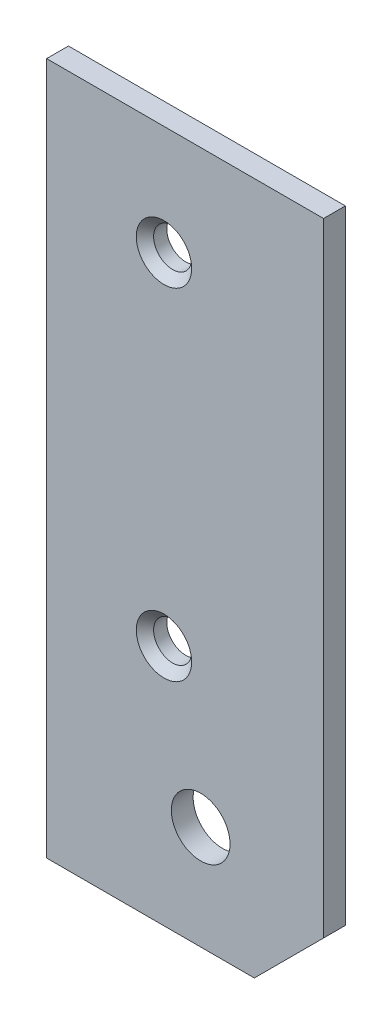
ISO-10303-21;
HEADER;
FILE_DESCRIPTION(('STEP AP214'),'2;1');
FILE_NAME('part.step','',(''),(''),'','','');
FILE_SCHEMA(('AUTOMOTIVE_DESIGN { 1 0 10303 214 1 1 1 1 }'));
ENDSEC;
DATA;
#1=APPLICATION_CONTEXT('core data for automotive mechanical design processes');
#2=APPLICATION_PROTOCOL_DEFINITION('international standard','automotive_design',2000,#1);
#3=PRODUCT_CONTEXT('',#1,'mechanical');
#4=PRODUCT('Part','Part','',(#3));
#5=PRODUCT_RELATED_PRODUCT_CATEGORY('part','',(#4));
#6=PRODUCT_DEFINITION_FORMATION('','',#4);
#7=PRODUCT_DEFINITION_CONTEXT('part definition',#1,'design');
#8=PRODUCT_DEFINITION('design','',#6,#7);
#9=PRODUCT_DEFINITION_SHAPE('','',#8);
#10=(LENGTH_UNIT() NAMED_UNIT(*) SI_UNIT(.MILLI.,.METRE.));
#11=(NAMED_UNIT(*) PLANE_ANGLE_UNIT() SI_UNIT($,.RADIAN.));
#12=(NAMED_UNIT(*) SI_UNIT($,.STERADIAN.) SOLID_ANGLE_UNIT());
#13=UNCERTAINTY_MEASURE_WITH_UNIT(LENGTH_MEASURE(1.E-05),#10,'distance_accuracy_value','');
#14=(GEOMETRIC_REPRESENTATION_CONTEXT(3) GLOBAL_UNCERTAINTY_ASSIGNED_CONTEXT((#13)) GLOBAL_UNIT_ASSIGNED_CONTEXT((#10,
#11,#12)) REPRESENTATION_CONTEXT('',''));
#15=CARTESIAN_POINT('',(0.,0.,0.));
#16=DIRECTION('',(0.,0.,1.));
#17=DIRECTION('',(1.,0.,0.));
#18=AXIS2_PLACEMENT_3D('',#15,#16,#17);
#19=CARTESIAN_POINT('',(10.16,-25.4,1.6002));
#20=DIRECTION('',(-1.,0.,0.));
#21=DIRECTION('',(0.,0.,1.));
#22=AXIS2_PLACEMENT_3D('',#19,#20,#21);
#23=PLANE('',#22);
#24=DIRECTION('',(0.,1.,0.));
#25=VECTOR('',#24,1.);
#26=CARTESIAN_POINT('',(10.16,-25.4,1.6002));
#27=LINE('',#26,#25);
#28=CARTESIAN_POINT('',(10.16,-20.32,1.6002));
#29=VERTEX_POINT('',#28);
#30=CARTESIAN_POINT('',(10.16,25.4,1.6002));
#31=VERTEX_POINT('',#30);
#32=EDGE_CURVE('E81',#29,#31,#27,.T.);
#33=ORIENTED_EDGE('',*,*,#32,.F.);
#34=DIRECTION('',(0.,0.,-1.));
#35=VECTOR('',#34,1.);
#36=CARTESIAN_POINT('',(10.16,-20.32,1.6002));
#37=LINE('',#36,#35);
#38=CARTESIAN_POINT('',(10.16,-20.32,0.));
#39=VERTEX_POINT('',#38);
#40=EDGE_CURVE('E104',#29,#39,#37,.T.);
#41=ORIENTED_EDGE('',*,*,#40,.T.);
#42=DIRECTION('',(0.,1.,0.));
#43=VECTOR('',#42,1.);
#44=CARTESIAN_POINT('',(10.16,-25.4,0.));
#45=LINE('',#44,#43);
#46=CARTESIAN_POINT('',(10.16,25.4,0.));
#47=VERTEX_POINT('',#46);
#48=EDGE_CURVE('E102',#39,#47,#45,.T.);
#49=ORIENTED_EDGE('',*,*,#48,.T.);
#50=DIRECTION('',(0.,0.,-1.));
#51=VECTOR('',#50,1.);
#52=CARTESIAN_POINT('',(10.16,25.4,1.6002));
#53=LINE('',#52,#51);
#54=EDGE_CURVE('E96',#31,#47,#53,.T.);
#55=ORIENTED_EDGE('',*,*,#54,.F.);
#56=EDGE_LOOP('',(#33,#41,#49,#55));
#57=FACE_BOUND('',#56,.T.);
#58=ADVANCED_FACE('F33',(#57),#23,.F.);
#59=CARTESIAN_POINT('',(-10.16,25.4,1.6002));
#60=DIRECTION('',(0.,-1.,0.));
#61=DIRECTION('',(0.,0.,-1.));
#62=AXIS2_PLACEMENT_3D('',#59,#60,#61);
#63=PLANE('',#62);
#64=DIRECTION('',(-1.,0.,0.));
#65=VECTOR('',#64,1.);
#66=CARTESIAN_POINT('',(-10.16,25.4,0.));
#67=LINE('',#66,#65);
#68=CARTESIAN_POINT('',(-10.16,25.4,0.));
#69=VERTEX_POINT('',#68);
#70=EDGE_CURVE('E117',#47,#69,#67,.T.);
#71=ORIENTED_EDGE('',*,*,#70,.T.);
#72=DIRECTION('',(0.,0.,-1.));
#73=VECTOR('',#72,1.);
#74=CARTESIAN_POINT('',(-10.16,25.4,1.6002));
#75=LINE('',#74,#73);
#76=CARTESIAN_POINT('',(-10.16,25.4,1.6002));
#77=VERTEX_POINT('',#76);
#78=EDGE_CURVE('E98',#77,#69,#75,.T.);
#79=ORIENTED_EDGE('',*,*,#78,.F.);
#80=DIRECTION('',(-1.,0.,0.));
#81=VECTOR('',#80,1.);
#82=CARTESIAN_POINT('',(-10.16,25.4,1.6002));
#83=LINE('',#82,#81);
#84=EDGE_CURVE('E84',#31,#77,#83,.T.);
#85=ORIENTED_EDGE('',*,*,#84,.F.);
#86=ORIENTED_EDGE('',*,*,#54,.T.);
#87=EDGE_LOOP('',(#71,#79,#85,#86));
#88=FACE_BOUND('',#87,.T.);
#89=ADVANCED_FACE('F95',(#88),#63,.F.);
#90=CARTESIAN_POINT('',(-10.16,-25.4,1.6002));
#91=DIRECTION('',(1.,0.,0.));
#92=DIRECTION('',(0.,0.,-1.));
#93=AXIS2_PLACEMENT_3D('',#90,#91,#92);
#94=PLANE('',#93);
#95=DIRECTION('',(0.,-1.,0.));
#96=VECTOR('',#95,1.);
#97=CARTESIAN_POINT('',(-10.16,-25.4,0.));
#98=LINE('',#97,#96);
#99=CARTESIAN_POINT('',(-10.16,-25.4,0.));
#100=VERTEX_POINT('',#99);
#101=EDGE_CURVE('E132',#69,#100,#98,.T.);
#102=ORIENTED_EDGE('',*,*,#101,.T.);
#103=DIRECTION('',(0.,0.,-1.));
#104=VECTOR('',#103,1.);
#105=CARTESIAN_POINT('',(-10.16,-25.4,1.6002));
#106=LINE('',#105,#104);
#107=CARTESIAN_POINT('',(-10.16,-25.4,1.6002));
#108=VERTEX_POINT('',#107);
#109=EDGE_CURVE('E107',#108,#100,#106,.T.);
#110=ORIENTED_EDGE('',*,*,#109,.F.);
#111=DIRECTION('',(0.,-1.,0.));
#112=VECTOR('',#111,1.);
#113=CARTESIAN_POINT('',(-10.16,-25.4,1.6002));
#114=LINE('',#113,#112);
#115=EDGE_CURVE('E100',#77,#108,#114,.T.);
#116=ORIENTED_EDGE('',*,*,#115,.F.);
#117=ORIENTED_EDGE('',*,*,#78,.T.);
#118=EDGE_LOOP('',(#102,#110,#116,#117));
#119=FACE_BOUND('',#118,.T.);
#120=ADVANCED_FACE('F140',(#119),#94,.F.);
#121=CARTESIAN_POINT('',(-10.16,-25.4,1.6002));
#122=DIRECTION('',(0.,1.,0.));
#123=DIRECTION('',(0.,0.,1.));
#124=AXIS2_PLACEMENT_3D('',#121,#122,#123);
#125=PLANE('',#124);
#126=DIRECTION('',(1.,0.,0.));
#127=VECTOR('',#126,1.);
#128=CARTESIAN_POINT('',(-10.16,-25.4,0.));
#129=LINE('',#128,#127);
#130=CARTESIAN_POINT('',(5.07999999999998,-25.4,0.));
#131=VERTEX_POINT('',#130);
#132=EDGE_CURVE('E91',#100,#131,#129,.T.);
#133=ORIENTED_EDGE('',*,*,#132,.T.);
#134=DIRECTION('',(0.,0.,1.));
#135=VECTOR('',#134,1.);
#136=CARTESIAN_POINT('',(5.07999999999998,-25.4,1.6002));
#137=LINE('',#136,#135);
#138=CARTESIAN_POINT('',(5.07999999999999,-25.4,1.6002));
#139=VERTEX_POINT('',#138);
#140=EDGE_CURVE('E42',#131,#139,#137,.T.);
#141=ORIENTED_EDGE('',*,*,#140,.T.);
#142=DIRECTION('',(1.,0.,0.));
#143=VECTOR('',#142,1.);
#144=CARTESIAN_POINT('',(-10.16,-25.4,1.6002));
#145=LINE('',#144,#143);
#146=EDGE_CURVE('E129',#108,#139,#145,.T.);
#147=ORIENTED_EDGE('',*,*,#146,.F.);
#148=ORIENTED_EDGE('',*,*,#109,.T.);
#149=EDGE_LOOP('',(#133,#141,#147,#148));
#150=FACE_BOUND('',#149,.T.);
#151=ADVANCED_FACE('F136',(#150),#125,.F.);
#152=CARTESIAN_POINT('',(0.,0.,1.6002));
#153=DIRECTION('',(0.,0.,-1.));
#154=DIRECTION('',(-1.,0.,0.));
#155=AXIS2_PLACEMENT_3D('',#152,#153,#154);
#156=PLANE('',#155);
#157=CARTESIAN_POINT('',(1.143,-17.78,1.6002));
#158=DIRECTION('',(0.,0.,1.));
#159=DIRECTION('',(1.,0.,0.));
#160=AXIS2_PLACEMENT_3D('',#157,#158,#159);
#161=CIRCLE('',#160,2.15265);
#162=CARTESIAN_POINT('',(3.29565,-17.78,1.6002));
#163=VERTEX_POINT('',#162);
#164=EDGE_CURVE('E187',#163,#163,#161,.T.);
#165=ORIENTED_EDGE('',*,*,#164,.F.);
#166=EDGE_LOOP('',(#165));
#167=FACE_BOUND('',#166,.T.);
#168=CARTESIAN_POINT('',(-1.5494,-7.62,1.6002));
#169=DIRECTION('',(0.,0.,1.));
#170=DIRECTION('',(1.,0.,0.));
#171=AXIS2_PLACEMENT_3D('',#168,#169,#170);
#172=CIRCLE('',#171,2.032);
#173=CARTESIAN_POINT('',(0.482599999999996,-7.62,1.6002));
#174=VERTEX_POINT('',#173);
#175=EDGE_CURVE('E189',#174,#174,#172,.T.);
#176=ORIENTED_EDGE('',*,*,#175,.F.);
#177=EDGE_LOOP('',(#176));
#178=FACE_BOUND('',#177,.T.);
#179=CARTESIAN_POINT('',(-1.5494,17.38,1.6002));
#180=DIRECTION('',(0.,0.,1.));
#181=DIRECTION('',(1.,0.,0.));
#182=AXIS2_PLACEMENT_3D('',#179,#180,#181);
#183=CIRCLE('',#182,2.032);
#184=CARTESIAN_POINT('',(0.482599999999996,17.38,1.6002));
#185=VERTEX_POINT('',#184);
#186=EDGE_CURVE('E120',#185,#185,#183,.T.);
#187=ORIENTED_EDGE('',*,*,#186,.F.);
#188=EDGE_LOOP('',(#187));
#189=FACE_BOUND('',#188,.T.);
#190=ORIENTED_EDGE('',*,*,#146,.T.);
#191=DIRECTION('',(-0.707106781186548,-0.707106781186547,0.));
#192=VECTOR('',#191,1.);
#193=CARTESIAN_POINT('',(10.16,-20.32,1.6002));
#194=LINE('',#193,#192);
#195=EDGE_CURVE('E11',#139,#29,#194,.F.);
#196=ORIENTED_EDGE('',*,*,#195,.T.);
#197=ORIENTED_EDGE('',*,*,#32,.T.);
#198=ORIENTED_EDGE('',*,*,#84,.T.);
#199=ORIENTED_EDGE('',*,*,#115,.T.);
#200=EDGE_LOOP('',(#190,#196,#197,#198,#199));
#201=FACE_BOUND('',#200,.T.);
#202=ADVANCED_FACE('F83',(#167,#178,#189,#201),#156,.F.);
#203=CARTESIAN_POINT('',(0.,0.,0.));
#204=DIRECTION('',(0.,0.,-1.));
#205=DIRECTION('',(-1.,0.,0.));
#206=AXIS2_PLACEMENT_3D('',#203,#204,#205);
#207=PLANE('',#206);
#208=CARTESIAN_POINT('',(1.143,-17.78,0.));
#209=DIRECTION('',(0.,0.,1.));
#210=DIRECTION('',(1.,0.,0.));
#211=AXIS2_PLACEMENT_3D('',#208,#209,#210);
#212=CIRCLE('',#211,2.15265);
#213=CARTESIAN_POINT('',(3.29565,-17.78,0.));
#214=VERTEX_POINT('',#213);
#215=EDGE_CURVE('E184',#214,#214,#212,.T.);
#216=ORIENTED_EDGE('',*,*,#215,.T.);
#217=EDGE_LOOP('',(#216));
#218=FACE_BOUND('',#217,.T.);
#219=CARTESIAN_POINT('',(-1.5494,-7.62,0.));
#220=DIRECTION('',(0.,0.,-1.));
#221=DIRECTION('',(-1.,0.,0.));
#222=AXIS2_PLACEMENT_3D('',#219,#220,#221);
#223=CIRCLE('',#222,1.39699999999999);
#224=CARTESIAN_POINT('',(-2.9464,-7.62,0.));
#225=VERTEX_POINT('',#224);
#226=EDGE_CURVE('E37',#225,#225,#223,.T.);
#227=ORIENTED_EDGE('',*,*,#226,.F.);
#228=EDGE_LOOP('',(#227));
#229=FACE_BOUND('',#228,.T.);
#230=CARTESIAN_POINT('',(-1.5494,17.38,0.));
#231=DIRECTION('',(0.,0.,-1.));
#232=DIRECTION('',(-1.,0.,0.));
#233=AXIS2_PLACEMENT_3D('',#230,#231,#232);
#234=CIRCLE('',#233,1.39699999999999);
#235=CARTESIAN_POINT('',(-2.9464,17.38,0.));
#236=VERTEX_POINT('',#235);
#237=EDGE_CURVE('E112',#236,#236,#234,.T.);
#238=ORIENTED_EDGE('',*,*,#237,.F.);
#239=EDGE_LOOP('',(#238));
#240=FACE_BOUND('',#239,.T.);
#241=ORIENTED_EDGE('',*,*,#48,.F.);
#242=DIRECTION('',(0.707106781186548,0.707106781186547,0.));
#243=VECTOR('',#242,1.);
#244=CARTESIAN_POINT('',(15.24,-15.24,0.));
#245=LINE('',#244,#243);
#246=EDGE_CURVE('E57',#39,#131,#245,.F.);
#247=ORIENTED_EDGE('',*,*,#246,.T.);
#248=ORIENTED_EDGE('',*,*,#132,.F.);
#249=ORIENTED_EDGE('',*,*,#101,.F.);
#250=ORIENTED_EDGE('',*,*,#70,.F.);
#251=EDGE_LOOP('',(#241,#247,#248,#249,#250));
#252=FACE_BOUND('',#251,.T.);
#253=ADVANCED_FACE('F139',(#218,#229,#240,#252),#207,.T.);
#254=CARTESIAN_POINT('',(10.16,-20.32,1.6002));
#255=DIRECTION('',(-0.707106781186547,0.707106781186548,0.));
#256=DIRECTION('',(0.,0.,-1.));
#257=AXIS2_PLACEMENT_3D('',#254,#255,#256);
#258=PLANE('',#257);
#259=ORIENTED_EDGE('',*,*,#195,.F.);
#260=ORIENTED_EDGE('',*,*,#140,.F.);
#261=ORIENTED_EDGE('',*,*,#246,.F.);
#262=ORIENTED_EDGE('',*,*,#40,.F.);
#263=EDGE_LOOP('',(#259,#260,#261,#262));
#264=FACE_BOUND('',#263,.T.);
#265=ADVANCED_FACE('F35',(#264),#258,.F.);
#266=CARTESIAN_POINT('',(-1.5494,17.38,1.6002));
#267=DIRECTION('',(0.,0.,1.));
#268=DIRECTION('',(1.,0.,0.));
#269=AXIS2_PLACEMENT_3D('',#266,#267,#268);
#270=CYLINDRICAL_SURFACE('',#269,1.39699999999999);
#271=ORIENTED_EDGE('',*,*,#237,.T.);
#272=EDGE_LOOP('',(#271));
#273=FACE_BOUND('',#272,.T.);
#274=CARTESIAN_POINT('',(-1.5494,17.38,0.9652));
#275=DIRECTION('',(0.,0.,1.));
#276=DIRECTION('',(1.,0.,0.));
#277=AXIS2_PLACEMENT_3D('',#274,#275,#276);
#278=CIRCLE('',#277,1.397);
#279=CARTESIAN_POINT('',(-0.152400000000004,17.38,0.9652));
#280=VERTEX_POINT('',#279);
#281=EDGE_CURVE('E114',#280,#280,#278,.T.);
#282=ORIENTED_EDGE('',*,*,#281,.T.);
#283=EDGE_LOOP('',(#282));
#284=FACE_BOUND('',#283,.T.);
#285=ADVANCED_FACE('F143',(#273,#284),#270,.F.);
#286=CARTESIAN_POINT('',(-1.5494,17.38,1.6002));
#287=DIRECTION('',(0.,0.,1.));
#288=DIRECTION('',(1.,0.,0.));
#289=AXIS2_PLACEMENT_3D('',#286,#287,#288);
#290=CONICAL_SURFACE('',#289,2.032,0.785398163397447);
#291=ORIENTED_EDGE('',*,*,#281,.F.);
#292=EDGE_LOOP('',(#291));
#293=FACE_BOUND('',#292,.T.);
#294=ORIENTED_EDGE('',*,*,#186,.T.);
#295=EDGE_LOOP('',(#294));
#296=FACE_BOUND('',#295,.T.);
#297=ADVANCED_FACE('F148',(#293,#296),#290,.F.);
#298=CARTESIAN_POINT('',(-1.5494,-7.62,1.6002));
#299=DIRECTION('',(0.,0.,1.));
#300=DIRECTION('',(1.,0.,0.));
#301=AXIS2_PLACEMENT_3D('',#298,#299,#300);
#302=CYLINDRICAL_SURFACE('',#301,1.39699999999999);
#303=ORIENTED_EDGE('',*,*,#226,.T.);
#304=EDGE_LOOP('',(#303));
#305=FACE_BOUND('',#304,.T.);
#306=CARTESIAN_POINT('',(-1.5494,-7.62,0.9652));
#307=DIRECTION('',(0.,0.,1.));
#308=DIRECTION('',(1.,0.,0.));
#309=AXIS2_PLACEMENT_3D('',#306,#307,#308);
#310=CIRCLE('',#309,1.397);
#311=CARTESIAN_POINT('',(-0.152400000000004,-7.62,0.9652));
#312=VERTEX_POINT('',#311);
#313=EDGE_CURVE('E193',#312,#312,#310,.T.);
#314=ORIENTED_EDGE('',*,*,#313,.T.);
#315=EDGE_LOOP('',(#314));
#316=FACE_BOUND('',#315,.T.);
#317=ADVANCED_FACE('F167',(#305,#316),#302,.F.);
#318=CARTESIAN_POINT('',(-1.5494,-7.62,1.6002));
#319=DIRECTION('',(0.,0.,1.));
#320=DIRECTION('',(1.,0.,0.));
#321=AXIS2_PLACEMENT_3D('',#318,#319,#320);
#322=CONICAL_SURFACE('',#321,2.032,0.785398163397447);
#323=ORIENTED_EDGE('',*,*,#313,.F.);
#324=EDGE_LOOP('',(#323));
#325=FACE_BOUND('',#324,.T.);
#326=ORIENTED_EDGE('',*,*,#175,.T.);
#327=EDGE_LOOP('',(#326));
#328=FACE_BOUND('',#327,.T.);
#329=ADVANCED_FACE('F171',(#325,#328),#322,.F.);
#330=CARTESIAN_POINT('',(1.143,-17.78,1.6002));
#331=DIRECTION('',(0.,0.,1.));
#332=DIRECTION('',(1.,0.,0.));
#333=AXIS2_PLACEMENT_3D('',#330,#331,#332);
#334=CYLINDRICAL_SURFACE('',#333,2.15265);
#335=ORIENTED_EDGE('',*,*,#215,.F.);
#336=EDGE_LOOP('',(#335));
#337=FACE_BOUND('',#336,.T.);
#338=ORIENTED_EDGE('',*,*,#164,.T.);
#339=EDGE_LOOP('',(#338));
#340=FACE_BOUND('',#339,.T.);
#341=ADVANCED_FACE('F175',(#337,#340),#334,.F.);
#342=CLOSED_SHELL('',(#58,#89,#120,#151,#202,#253,#265,#285,#297,#317,#329,#341));
#343=MANIFOLD_SOLID_BREP('B2',#342);
#344=ADVANCED_BREP_SHAPE_REPRESENTATION('',(#18,#343),#14);
#345=SHAPE_DEFINITION_REPRESENTATION(#9,#344);
ENDSEC;
END-ISO-10303-21;
